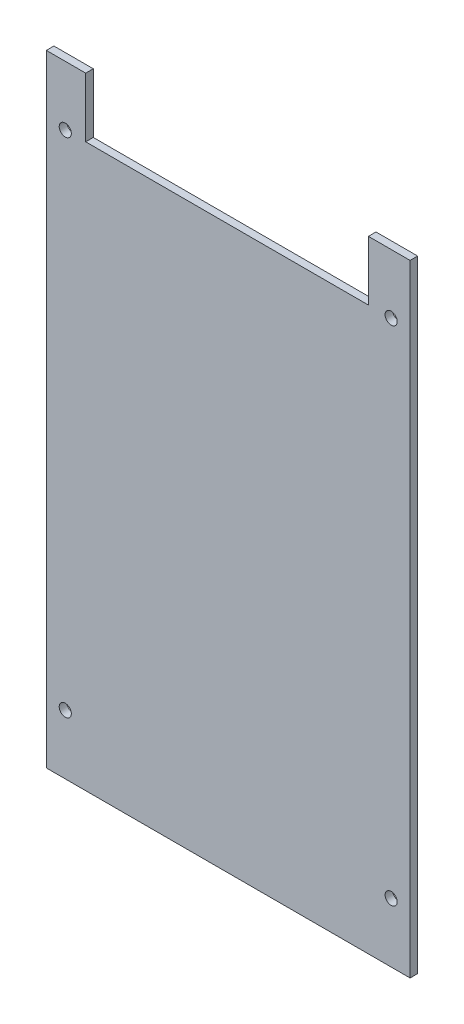
ISO-10303-21;
HEADER;
FILE_DESCRIPTION(('STEP AP214'),'2;1');
FILE_NAME('part.step','',(''),(''),'','','');
FILE_SCHEMA(('AUTOMOTIVE_DESIGN { 1 0 10303 214 1 1 1 1 }'));
ENDSEC;
DATA;
#1=APPLICATION_CONTEXT('core data for automotive mechanical design processes');
#2=APPLICATION_PROTOCOL_DEFINITION('international standard','automotive_design',2000,#1);
#3=PRODUCT_CONTEXT('',#1,'mechanical');
#4=PRODUCT('Part','Part','',(#3));
#5=PRODUCT_RELATED_PRODUCT_CATEGORY('part','',(#4));
#6=PRODUCT_DEFINITION_FORMATION('','',#4);
#7=PRODUCT_DEFINITION_CONTEXT('part definition',#1,'design');
#8=PRODUCT_DEFINITION('design','',#6,#7);
#9=PRODUCT_DEFINITION_SHAPE('','',#8);
#10=(LENGTH_UNIT() NAMED_UNIT(*) SI_UNIT(.MILLI.,.METRE.));
#11=(NAMED_UNIT(*) PLANE_ANGLE_UNIT() SI_UNIT($,.RADIAN.));
#12=(NAMED_UNIT(*) SI_UNIT($,.STERADIAN.) SOLID_ANGLE_UNIT());
#13=UNCERTAINTY_MEASURE_WITH_UNIT(LENGTH_MEASURE(1.E-05),#10,'distance_accuracy_value','');
#14=(GEOMETRIC_REPRESENTATION_CONTEXT(3) GLOBAL_UNCERTAINTY_ASSIGNED_CONTEXT((#13)) GLOBAL_UNIT_ASSIGNED_CONTEXT((#10,
#11,#12)) REPRESENTATION_CONTEXT('',''));
#15=CARTESIAN_POINT('',(0.,0.,0.));
#16=DIRECTION('',(0.,0.,1.));
#17=DIRECTION('',(1.,0.,0.));
#18=AXIS2_PLACEMENT_3D('',#15,#16,#17);
#19=CARTESIAN_POINT('',(0.,0.,55.));
#20=DIRECTION('',(0.,0.,-1.));
#21=DIRECTION('',(-1.,0.,0.));
#22=AXIS2_PLACEMENT_3D('',#19,#20,#21);
#23=PLANE('',#22);
#24=DIRECTION('',(0.,1.,0.));
#25=VECTOR('',#24,1.);
#26=CARTESIAN_POINT('',(117.,82.,55.));
#27=LINE('',#26,#25);
#28=CARTESIAN_POINT('',(117.,-82.,55.));
#29=VERTEX_POINT('',#28);
#30=CARTESIAN_POINT('',(117.,82.,55.));
#31=VERTEX_POINT('',#30);
#32=EDGE_CURVE('E128',#29,#31,#27,.T.);
#33=ORIENTED_EDGE('',*,*,#32,.T.);
#34=DIRECTION('',(-1.,0.,0.));
#35=VECTOR('',#34,1.);
#36=CARTESIAN_POINT('',(117.,82.,55.));
#37=LINE('',#36,#35);
#38=CARTESIAN_POINT('',(105.994732545882,82.,55.));
#39=VERTEX_POINT('',#38);
#40=EDGE_CURVE('E76',#31,#39,#37,.T.);
#41=ORIENTED_EDGE('',*,*,#40,.T.);
#42=DIRECTION('',(0.,-1.,0.));
#43=VECTOR('',#42,1.);
#44=CARTESIAN_POINT('',(105.994732545882,82.,55.));
#45=LINE('',#44,#43);
#46=CARTESIAN_POINT('',(105.994732545882,66.3,55.));
#47=VERTEX_POINT('',#46);
#48=EDGE_CURVE('E143',#39,#47,#45,.T.);
#49=ORIENTED_EDGE('',*,*,#48,.T.);
#50=DIRECTION('',(-1.,0.,0.));
#51=VECTOR('',#50,1.);
#52=CARTESIAN_POINT('',(31.3934835543359,66.3,55.));
#53=LINE('',#52,#51);
#54=CARTESIAN_POINT('',(31.3934835543359,66.3,55.));
#55=VERTEX_POINT('',#54);
#56=EDGE_CURVE('E156',#47,#55,#53,.T.);
#57=ORIENTED_EDGE('',*,*,#56,.T.);
#58=DIRECTION('',(0.,1.,0.));
#59=VECTOR('',#58,1.);
#60=CARTESIAN_POINT('',(31.3934835543359,82.,55.));
#61=LINE('',#60,#59);
#62=CARTESIAN_POINT('',(31.3934835543359,82.,55.));
#63=VERTEX_POINT('',#62);
#64=EDGE_CURVE('E95',#55,#63,#61,.T.);
#65=ORIENTED_EDGE('',*,*,#64,.T.);
#66=DIRECTION('',(-1.,0.,0.));
#67=VECTOR('',#66,1.);
#68=CARTESIAN_POINT('',(31.3934835543359,82.,55.));
#69=LINE('',#68,#67);
#70=CARTESIAN_POINT('',(21.,82.,55.));
#71=VERTEX_POINT('',#70);
#72=EDGE_CURVE('E89',#63,#71,#69,.T.);
#73=ORIENTED_EDGE('',*,*,#72,.T.);
#74=DIRECTION('',(0.,-1.,0.));
#75=VECTOR('',#74,1.);
#76=CARTESIAN_POINT('',(21.,82.,55.));
#77=LINE('',#76,#75);
#78=CARTESIAN_POINT('',(21.,-81.9999999999999,55.));
#79=VERTEX_POINT('',#78);
#80=EDGE_CURVE('E93',#71,#79,#77,.T.);
#81=ORIENTED_EDGE('',*,*,#80,.T.);
#82=DIRECTION('',(1.,0.,0.));
#83=VECTOR('',#82,1.);
#84=CARTESIAN_POINT('',(117.,-82.,55.));
#85=LINE('',#84,#83);
#86=EDGE_CURVE('E33',#79,#29,#85,.T.);
#87=ORIENTED_EDGE('',*,*,#86,.T.);
#88=EDGE_LOOP('',(#33,#41,#49,#57,#65,#73,#81,#87));
#89=FACE_BOUND('',#88,.T.);
#90=CARTESIAN_POINT('',(112.,66.3,55.));
#91=DIRECTION('',(0.,0.,1.));
#92=DIRECTION('',(1.,0.,0.));
#93=AXIS2_PLACEMENT_3D('',#90,#91,#92);
#94=CIRCLE('',#93,1.60000000000001);
#95=CARTESIAN_POINT('',(113.6,66.3,55.));
#96=VERTEX_POINT('',#95);
#97=EDGE_CURVE('E117',#96,#96,#94,.T.);
#98=ORIENTED_EDGE('',*,*,#97,.F.);
#99=EDGE_LOOP('',(#98));
#100=FACE_BOUND('',#99,.T.);
#101=CARTESIAN_POINT('',(26.,66.3,55.));
#102=DIRECTION('',(0.,0.,1.));
#103=DIRECTION('',(1.,0.,0.));
#104=AXIS2_PLACEMENT_3D('',#101,#102,#103);
#105=CIRCLE('',#104,1.60000000000001);
#106=CARTESIAN_POINT('',(27.6,66.3,55.));
#107=VERTEX_POINT('',#106);
#108=EDGE_CURVE('E165',#107,#107,#105,.T.);
#109=ORIENTED_EDGE('',*,*,#108,.F.);
#110=EDGE_LOOP('',(#109));
#111=FACE_BOUND('',#110,.T.);
#112=CARTESIAN_POINT('',(112.,-66.3,55.));
#113=DIRECTION('',(0.,0.,1.));
#114=DIRECTION('',(1.,0.,0.));
#115=AXIS2_PLACEMENT_3D('',#112,#113,#114);
#116=CIRCLE('',#115,1.60000000000001);
#117=CARTESIAN_POINT('',(113.6,-66.3,55.));
#118=VERTEX_POINT('',#117);
#119=EDGE_CURVE('E171',#118,#118,#116,.T.);
#120=ORIENTED_EDGE('',*,*,#119,.F.);
#121=EDGE_LOOP('',(#120));
#122=FACE_BOUND('',#121,.T.);
#123=CARTESIAN_POINT('',(26.,-66.3,55.));
#124=DIRECTION('',(0.,0.,1.));
#125=DIRECTION('',(1.,0.,0.));
#126=AXIS2_PLACEMENT_3D('',#123,#124,#125);
#127=CIRCLE('',#126,1.60000000000001);
#128=CARTESIAN_POINT('',(27.6,-66.3,55.));
#129=VERTEX_POINT('',#128);
#130=EDGE_CURVE('E177',#129,#129,#127,.T.);
#131=ORIENTED_EDGE('',*,*,#130,.F.);
#132=EDGE_LOOP('',(#131));
#133=FACE_BOUND('',#132,.T.);
#134=ADVANCED_FACE('F16',(#89,#100,#111,#122,#133),#23,.F.);
#135=CARTESIAN_POINT('',(0.,0.,53.));
#136=DIRECTION('',(0.,0.,-1.));
#137=DIRECTION('',(-1.,0.,0.));
#138=AXIS2_PLACEMENT_3D('',#135,#136,#137);
#139=PLANE('',#138);
#140=CARTESIAN_POINT('',(112.,-66.3,53.));
#141=DIRECTION('',(0.,0.,1.));
#142=DIRECTION('',(1.,0.,0.));
#143=AXIS2_PLACEMENT_3D('',#140,#141,#142);
#144=CIRCLE('',#143,1.60000000000001);
#145=CARTESIAN_POINT('',(113.6,-66.3,53.));
#146=VERTEX_POINT('',#145);
#147=EDGE_CURVE('E174',#146,#146,#144,.T.);
#148=ORIENTED_EDGE('',*,*,#147,.T.);
#149=EDGE_LOOP('',(#148));
#150=FACE_BOUND('',#149,.T.);
#151=CARTESIAN_POINT('',(112.,66.3,53.));
#152=DIRECTION('',(0.,0.,1.));
#153=DIRECTION('',(1.,0.,0.));
#154=AXIS2_PLACEMENT_3D('',#151,#152,#153);
#155=CIRCLE('',#154,1.60000000000001);
#156=CARTESIAN_POINT('',(113.6,66.3,53.));
#157=VERTEX_POINT('',#156);
#158=EDGE_CURVE('E162',#157,#157,#155,.T.);
#159=ORIENTED_EDGE('',*,*,#158,.T.);
#160=EDGE_LOOP('',(#159));
#161=FACE_BOUND('',#160,.T.);
#162=DIRECTION('',(0.,1.,0.));
#163=VECTOR('',#162,1.);
#164=CARTESIAN_POINT('',(117.,82.,53.));
#165=LINE('',#164,#163);
#166=CARTESIAN_POINT('',(117.,-82.,53.));
#167=VERTEX_POINT('',#166);
#168=CARTESIAN_POINT('',(117.,82.,53.));
#169=VERTEX_POINT('',#168);
#170=EDGE_CURVE('E113',#167,#169,#165,.T.);
#171=ORIENTED_EDGE('',*,*,#170,.F.);
#172=DIRECTION('',(1.,0.,0.));
#173=VECTOR('',#172,1.);
#174=CARTESIAN_POINT('',(117.,-82.,53.));
#175=LINE('',#174,#173);
#176=CARTESIAN_POINT('',(21.,-81.9999999999999,53.));
#177=VERTEX_POINT('',#176);
#178=EDGE_CURVE('E68',#177,#167,#175,.T.);
#179=ORIENTED_EDGE('',*,*,#178,.F.);
#180=DIRECTION('',(0.,-1.,0.));
#181=VECTOR('',#180,1.);
#182=CARTESIAN_POINT('',(21.,82.,53.));
#183=LINE('',#182,#181);
#184=CARTESIAN_POINT('',(21.,82.,53.));
#185=VERTEX_POINT('',#184);
#186=EDGE_CURVE('E62',#185,#177,#183,.T.);
#187=ORIENTED_EDGE('',*,*,#186,.F.);
#188=DIRECTION('',(-1.,0.,0.));
#189=VECTOR('',#188,1.);
#190=CARTESIAN_POINT('',(31.3934835543359,82.,53.));
#191=LINE('',#190,#189);
#192=CARTESIAN_POINT('',(31.3934835543359,82.,53.));
#193=VERTEX_POINT('',#192);
#194=EDGE_CURVE('E103',#193,#185,#191,.T.);
#195=ORIENTED_EDGE('',*,*,#194,.F.);
#196=DIRECTION('',(0.,1.,0.));
#197=VECTOR('',#196,1.);
#198=CARTESIAN_POINT('',(31.3934835543359,82.,53.));
#199=LINE('',#198,#197);
#200=CARTESIAN_POINT('',(31.3934835543359,66.3,53.));
#201=VERTEX_POINT('',#200);
#202=EDGE_CURVE('E123',#201,#193,#199,.T.);
#203=ORIENTED_EDGE('',*,*,#202,.F.);
#204=DIRECTION('',(-1.,0.,0.));
#205=VECTOR('',#204,1.);
#206=CARTESIAN_POINT('',(31.3934835543359,66.3,53.));
#207=LINE('',#206,#205);
#208=CARTESIAN_POINT('',(105.994732545882,66.3,53.));
#209=VERTEX_POINT('',#208);
#210=EDGE_CURVE('E121',#209,#201,#207,.T.);
#211=ORIENTED_EDGE('',*,*,#210,.F.);
#212=DIRECTION('',(0.,-1.,0.));
#213=VECTOR('',#212,1.);
#214=CARTESIAN_POINT('',(105.994732545882,82.,53.));
#215=LINE('',#214,#213);
#216=CARTESIAN_POINT('',(105.994732545882,82.,53.));
#217=VERTEX_POINT('',#216);
#218=EDGE_CURVE('E119',#217,#209,#215,.T.);
#219=ORIENTED_EDGE('',*,*,#218,.F.);
#220=DIRECTION('',(-1.,0.,0.));
#221=VECTOR('',#220,1.);
#222=CARTESIAN_POINT('',(117.,82.,53.));
#223=LINE('',#222,#221);
#224=EDGE_CURVE('E116',#169,#217,#223,.T.);
#225=ORIENTED_EDGE('',*,*,#224,.F.);
#226=EDGE_LOOP('',(#171,#179,#187,#195,#203,#211,#219,#225));
#227=FACE_BOUND('',#226,.T.);
#228=CARTESIAN_POINT('',(26.,66.3,53.));
#229=DIRECTION('',(0.,0.,1.));
#230=DIRECTION('',(1.,0.,0.));
#231=AXIS2_PLACEMENT_3D('',#228,#229,#230);
#232=CIRCLE('',#231,1.60000000000001);
#233=CARTESIAN_POINT('',(27.6,66.3,53.));
#234=VERTEX_POINT('',#233);
#235=EDGE_CURVE('E168',#234,#234,#232,.T.);
#236=ORIENTED_EDGE('',*,*,#235,.T.);
#237=EDGE_LOOP('',(#236));
#238=FACE_BOUND('',#237,.T.);
#239=CARTESIAN_POINT('',(26.,-66.3,53.));
#240=DIRECTION('',(0.,0.,1.));
#241=DIRECTION('',(1.,0.,0.));
#242=AXIS2_PLACEMENT_3D('',#239,#240,#241);
#243=CIRCLE('',#242,1.60000000000001);
#244=CARTESIAN_POINT('',(27.6,-66.3,53.));
#245=VERTEX_POINT('',#244);
#246=EDGE_CURVE('E180',#245,#245,#243,.T.);
#247=ORIENTED_EDGE('',*,*,#246,.T.);
#248=EDGE_LOOP('',(#247));
#249=FACE_BOUND('',#248,.T.);
#250=ADVANCED_FACE('F147',(#150,#161,#227,#238,#249),#139,.T.);
#251=CARTESIAN_POINT('',(117.,82.,55.));
#252=DIRECTION('',(-1.,0.,0.));
#253=DIRECTION('',(0.,0.,1.));
#254=AXIS2_PLACEMENT_3D('',#251,#252,#253);
#255=PLANE('',#254);
#256=ORIENTED_EDGE('',*,*,#170,.T.);
#257=DIRECTION('',(0.,0.,-1.));
#258=VECTOR('',#257,1.);
#259=CARTESIAN_POINT('',(117.,82.,55.));
#260=LINE('',#259,#258);
#261=EDGE_CURVE('E10',#31,#169,#260,.T.);
#262=ORIENTED_EDGE('',*,*,#261,.F.);
#263=ORIENTED_EDGE('',*,*,#32,.F.);
#264=DIRECTION('',(0.,0.,-1.));
#265=VECTOR('',#264,1.);
#266=CARTESIAN_POINT('',(117.,-82.,55.));
#267=LINE('',#266,#265);
#268=EDGE_CURVE('E109',#29,#167,#267,.T.);
#269=ORIENTED_EDGE('',*,*,#268,.T.);
#270=EDGE_LOOP('',(#256,#262,#263,#269));
#271=FACE_BOUND('',#270,.T.);
#272=ADVANCED_FACE('F18',(#271),#255,.F.);
#273=CARTESIAN_POINT('',(117.,82.,55.));
#274=DIRECTION('',(0.,-1.,0.));
#275=DIRECTION('',(1.,0.,0.));
#276=AXIS2_PLACEMENT_3D('',#273,#274,#275);
#277=PLANE('',#276);
#278=ORIENTED_EDGE('',*,*,#224,.T.);
#279=DIRECTION('',(0.,0.,-1.));
#280=VECTOR('',#279,1.);
#281=CARTESIAN_POINT('',(105.994732545882,82.,55.));
#282=LINE('',#281,#280);
#283=EDGE_CURVE('E25',#39,#217,#282,.T.);
#284=ORIENTED_EDGE('',*,*,#283,.F.);
#285=ORIENTED_EDGE('',*,*,#40,.F.);
#286=ORIENTED_EDGE('',*,*,#261,.T.);
#287=EDGE_LOOP('',(#278,#284,#285,#286));
#288=FACE_BOUND('',#287,.T.);
#289=ADVANCED_FACE('F214',(#288),#277,.F.);
#290=CARTESIAN_POINT('',(105.994732545882,82.,55.));
#291=DIRECTION('',(1.,0.,0.));
#292=DIRECTION('',(0.,0.,-1.));
#293=AXIS2_PLACEMENT_3D('',#290,#291,#292);
#294=PLANE('',#293);
#295=ORIENTED_EDGE('',*,*,#218,.T.);
#296=DIRECTION('',(0.,0.,-1.));
#297=VECTOR('',#296,1.);
#298=CARTESIAN_POINT('',(105.994732545882,66.3,55.));
#299=LINE('',#298,#297);
#300=EDGE_CURVE('E135',#47,#209,#299,.T.);
#301=ORIENTED_EDGE('',*,*,#300,.F.);
#302=ORIENTED_EDGE('',*,*,#48,.F.);
#303=ORIENTED_EDGE('',*,*,#283,.T.);
#304=EDGE_LOOP('',(#295,#301,#302,#303));
#305=FACE_BOUND('',#304,.T.);
#306=ADVANCED_FACE('F141',(#305),#294,.F.);
#307=CARTESIAN_POINT('',(31.3934835543359,66.3,55.));
#308=DIRECTION('',(0.,-1.,0.));
#309=DIRECTION('',(0.,0.,-1.));
#310=AXIS2_PLACEMENT_3D('',#307,#308,#309);
#311=PLANE('',#310);
#312=ORIENTED_EDGE('',*,*,#210,.T.);
#313=DIRECTION('',(0.,0.,-1.));
#314=VECTOR('',#313,1.);
#315=CARTESIAN_POINT('',(31.3934835543359,66.3,55.));
#316=LINE('',#315,#314);
#317=EDGE_CURVE('E132',#55,#201,#316,.T.);
#318=ORIENTED_EDGE('',*,*,#317,.F.);
#319=ORIENTED_EDGE('',*,*,#56,.F.);
#320=ORIENTED_EDGE('',*,*,#300,.T.);
#321=EDGE_LOOP('',(#312,#318,#319,#320));
#322=FACE_BOUND('',#321,.T.);
#323=ADVANCED_FACE('F152',(#322),#311,.F.);
#324=CARTESIAN_POINT('',(31.3934835543359,82.,55.));
#325=DIRECTION('',(-1.,0.,0.));
#326=DIRECTION('',(0.,0.,1.));
#327=AXIS2_PLACEMENT_3D('',#324,#325,#326);
#328=PLANE('',#327);
#329=ORIENTED_EDGE('',*,*,#202,.T.);
#330=DIRECTION('',(0.,0.,-1.));
#331=VECTOR('',#330,1.);
#332=CARTESIAN_POINT('',(31.3934835543359,82.,55.));
#333=LINE('',#332,#331);
#334=EDGE_CURVE('E104',#63,#193,#333,.T.);
#335=ORIENTED_EDGE('',*,*,#334,.F.);
#336=ORIENTED_EDGE('',*,*,#64,.F.);
#337=ORIENTED_EDGE('',*,*,#317,.T.);
#338=EDGE_LOOP('',(#329,#335,#336,#337));
#339=FACE_BOUND('',#338,.T.);
#340=ADVANCED_FACE('F155',(#339),#328,.F.);
#341=CARTESIAN_POINT('',(31.3934835543359,82.,55.));
#342=DIRECTION('',(0.,-1.,0.));
#343=DIRECTION('',(0.,0.,-1.));
#344=AXIS2_PLACEMENT_3D('',#341,#342,#343);
#345=PLANE('',#344);
#346=ORIENTED_EDGE('',*,*,#194,.T.);
#347=DIRECTION('',(0.,0.,-1.));
#348=VECTOR('',#347,1.);
#349=CARTESIAN_POINT('',(21.,82.,55.));
#350=LINE('',#349,#348);
#351=EDGE_CURVE('E100',#71,#185,#350,.T.);
#352=ORIENTED_EDGE('',*,*,#351,.F.);
#353=ORIENTED_EDGE('',*,*,#72,.F.);
#354=ORIENTED_EDGE('',*,*,#334,.T.);
#355=EDGE_LOOP('',(#346,#352,#353,#354));
#356=FACE_BOUND('',#355,.T.);
#357=ADVANCED_FACE('F101',(#356),#345,.F.);
#358=CARTESIAN_POINT('',(21.,82.,55.));
#359=DIRECTION('',(1.,0.,0.));
#360=DIRECTION('',(0.,0.,-1.));
#361=AXIS2_PLACEMENT_3D('',#358,#359,#360);
#362=PLANE('',#361);
#363=ORIENTED_EDGE('',*,*,#186,.T.);
#364=DIRECTION('',(0.,0.,-1.));
#365=VECTOR('',#364,1.);
#366=CARTESIAN_POINT('',(21.,-81.9999999999999,55.));
#367=LINE('',#366,#365);
#368=EDGE_CURVE('E105',#79,#177,#367,.T.);
#369=ORIENTED_EDGE('',*,*,#368,.F.);
#370=ORIENTED_EDGE('',*,*,#80,.F.);
#371=ORIENTED_EDGE('',*,*,#351,.T.);
#372=EDGE_LOOP('',(#363,#369,#370,#371));
#373=FACE_BOUND('',#372,.T.);
#374=ADVANCED_FACE('F107',(#373),#362,.F.);
#375=CARTESIAN_POINT('',(117.,-82.,55.));
#376=DIRECTION('',(0.,1.,0.));
#377=DIRECTION('',(-1.,0.,0.));
#378=AXIS2_PLACEMENT_3D('',#375,#376,#377);
#379=PLANE('',#378);
#380=ORIENTED_EDGE('',*,*,#178,.T.);
#381=ORIENTED_EDGE('',*,*,#268,.F.);
#382=ORIENTED_EDGE('',*,*,#86,.F.);
#383=ORIENTED_EDGE('',*,*,#368,.T.);
#384=EDGE_LOOP('',(#380,#381,#382,#383));
#385=FACE_BOUND('',#384,.T.);
#386=ADVANCED_FACE('F202',(#385),#379,.F.);
#387=CARTESIAN_POINT('',(112.,66.3,55.));
#388=DIRECTION('',(0.,0.,-1.));
#389=DIRECTION('',(-1.,0.,0.));
#390=AXIS2_PLACEMENT_3D('',#387,#388,#389);
#391=CYLINDRICAL_SURFACE('',#390,1.60000000000001);
#392=ORIENTED_EDGE('',*,*,#97,.T.);
#393=EDGE_LOOP('',(#392));
#394=FACE_BOUND('',#393,.T.);
#395=ORIENTED_EDGE('',*,*,#158,.F.);
#396=EDGE_LOOP('',(#395));
#397=FACE_BOUND('',#396,.T.);
#398=ADVANCED_FACE('F199',(#394,#397),#391,.F.);
#399=CARTESIAN_POINT('',(26.,66.3,55.));
#400=DIRECTION('',(0.,0.,-1.));
#401=DIRECTION('',(-1.,0.,0.));
#402=AXIS2_PLACEMENT_3D('',#399,#400,#401);
#403=CYLINDRICAL_SURFACE('',#402,1.60000000000001);
#404=ORIENTED_EDGE('',*,*,#108,.T.);
#405=EDGE_LOOP('',(#404));
#406=FACE_BOUND('',#405,.T.);
#407=ORIENTED_EDGE('',*,*,#235,.F.);
#408=EDGE_LOOP('',(#407));
#409=FACE_BOUND('',#408,.T.);
#410=ADVANCED_FACE('F289',(#406,#409),#403,.F.);
#411=CARTESIAN_POINT('',(112.,-66.3,55.));
#412=DIRECTION('',(0.,0.,-1.));
#413=DIRECTION('',(-1.,0.,0.));
#414=AXIS2_PLACEMENT_3D('',#411,#412,#413);
#415=CYLINDRICAL_SURFACE('',#414,1.60000000000001);
#416=ORIENTED_EDGE('',*,*,#119,.T.);
#417=EDGE_LOOP('',(#416));
#418=FACE_BOUND('',#417,.T.);
#419=ORIENTED_EDGE('',*,*,#147,.F.);
#420=EDGE_LOOP('',(#419));
#421=FACE_BOUND('',#420,.T.);
#422=ADVANCED_FACE('F296',(#418,#421),#415,.F.);
#423=CARTESIAN_POINT('',(26.,-66.3,55.));
#424=DIRECTION('',(0.,0.,-1.));
#425=DIRECTION('',(-1.,0.,0.));
#426=AXIS2_PLACEMENT_3D('',#423,#424,#425);
#427=CYLINDRICAL_SURFACE('',#426,1.60000000000001);
#428=ORIENTED_EDGE('',*,*,#130,.T.);
#429=EDGE_LOOP('',(#428));
#430=FACE_BOUND('',#429,.T.);
#431=ORIENTED_EDGE('',*,*,#246,.F.);
#432=EDGE_LOOP('',(#431));
#433=FACE_BOUND('',#432,.T.);
#434=ADVANCED_FACE('F186',(#430,#433),#427,.F.);
#435=CLOSED_SHELL('',(#134,#250,#272,#289,#306,#323,#340,#357,#374,#386,#398,#410,#422,#434));
#436=MANIFOLD_SOLID_BREP('B1',#435);
#437=ADVANCED_BREP_SHAPE_REPRESENTATION('',(#18,#436),#14);
#438=SHAPE_DEFINITION_REPRESENTATION(#9,#437);
ENDSEC;
END-ISO-10303-21;
